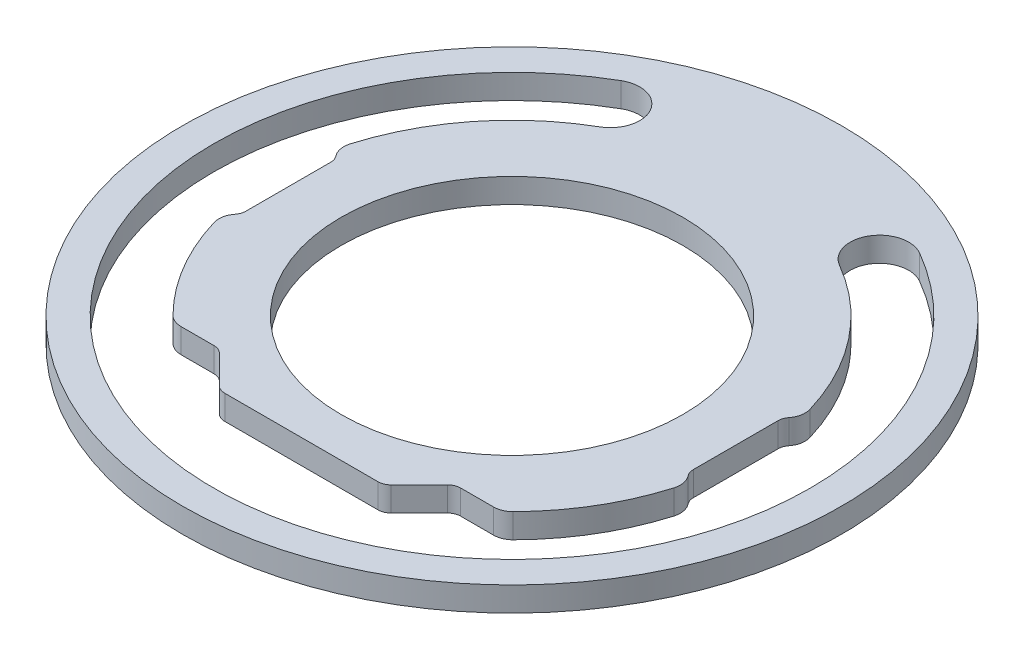
ISO-10303-21;
HEADER;
FILE_DESCRIPTION(('STEP AP214'),'2;1');
FILE_NAME('part.step','',(''),(''),'','','');
FILE_SCHEMA(('AUTOMOTIVE_DESIGN { 1 0 10303 214 1 1 1 1 }'));
ENDSEC;
DATA;
#1=APPLICATION_CONTEXT('core data for automotive mechanical design processes');
#2=APPLICATION_PROTOCOL_DEFINITION('international standard','automotive_design',2000,#1);
#3=PRODUCT_CONTEXT('',#1,'mechanical');
#4=PRODUCT('Part','Part','',(#3));
#5=PRODUCT_RELATED_PRODUCT_CATEGORY('part','',(#4));
#6=PRODUCT_DEFINITION_FORMATION('','',#4);
#7=PRODUCT_DEFINITION_CONTEXT('part definition',#1,'design');
#8=PRODUCT_DEFINITION('design','',#6,#7);
#9=PRODUCT_DEFINITION_SHAPE('','',#8);
#10=(LENGTH_UNIT() NAMED_UNIT(*) SI_UNIT(.MILLI.,.METRE.));
#11=(NAMED_UNIT(*) PLANE_ANGLE_UNIT() SI_UNIT($,.RADIAN.));
#12=(NAMED_UNIT(*) SI_UNIT($,.STERADIAN.) SOLID_ANGLE_UNIT());
#13=UNCERTAINTY_MEASURE_WITH_UNIT(LENGTH_MEASURE(1.E-05),#10,'distance_accuracy_value','');
#14=(GEOMETRIC_REPRESENTATION_CONTEXT(3) GLOBAL_UNCERTAINTY_ASSIGNED_CONTEXT((#13)) GLOBAL_UNIT_ASSIGNED_CONTEXT((#10,
#11,#12)) REPRESENTATION_CONTEXT('',''));
#15=CARTESIAN_POINT('',(0.,0.,0.));
#16=DIRECTION('',(0.,0.,1.));
#17=DIRECTION('',(1.,0.,0.));
#18=AXIS2_PLACEMENT_3D('',#15,#16,#17);
#19=CARTESIAN_POINT('',(0.,3.175,0.));
#20=DIRECTION('',(0.,1.,0.));
#21=DIRECTION('',(0.,0.,1.));
#22=AXIS2_PLACEMENT_3D('',#19,#20,#21);
#23=PLANE('',#22);
#24=DIRECTION('',(1.,0.,0.));
#25=VECTOR('',#24,1.);
#26=CARTESIAN_POINT('',(0.,3.175,22.7217897993642));
#27=LINE('',#26,#25);
#28=CARTESIAN_POINT('',(16.0371198799042,3.175,22.7217897993642));
#29=VERTEX_POINT('',#28);
#30=CARTESIAN_POINT('',(20.3189331103846,3.175,22.7217897993641));
#31=VERTEX_POINT('',#30);
#32=EDGE_CURVE('E299',#29,#31,#27,.T.);
#33=ORIENTED_EDGE('',*,*,#32,.T.);
#34=CARTESIAN_POINT('',(20.3189331103845,3.175,20.1817897993641));
#35=DIRECTION('',(0.,1.,0.));
#36=DIRECTION('',(0.,0.,1.));
#37=AXIS2_PLACEMENT_3D('',#34,#35,#36);
#38=CIRCLE('',#37,2.54);
#39=CARTESIAN_POINT('',(22.1210557809286,3.175,21.9717489833432));
#40=VERTEX_POINT('',#39);
#41=EDGE_CURVE('E471',#31,#40,#38,.T.);
#42=ORIENTED_EDGE('',*,*,#41,.T.);
#43=CARTESIAN_POINT('',(0.,3.175,0.));
#44=DIRECTION('',(0.,-1.,0.));
#45=DIRECTION('',(0.,0.,1.));
#46=AXIS2_PLACEMENT_3D('',#43,#44,#45);
#47=CIRCLE('',#46,31.1785);
#48=CARTESIAN_POINT('',(29.8983970830745,3.175,8.84221205993165));
#49=VERTEX_POINT('',#48);
#50=EDGE_CURVE('E418',#49,#40,#47,.T.);
#51=ORIENTED_EDGE('',*,*,#50,.F.);
#52=CARTESIAN_POINT('',(27.4626824530888,3.175,8.12186891859302));
#53=DIRECTION('',(0.,1.,0.));
#54=DIRECTION('',(0.,0.,1.));
#55=AXIS2_PLACEMENT_3D('',#52,#53,#54);
#56=CIRCLE('',#55,2.54);
#57=CARTESIAN_POINT('',(29.4606461810242,3.175,6.553512791352));
#58=VERTEX_POINT('',#57);
#59=EDGE_CURVE('E462',#49,#58,#56,.T.);
#60=ORIENTED_EDGE('',*,*,#59,.T.);
#61=CARTESIAN_POINT('',(30.7900000000049,3.175,5.51000024999875));
#62=DIRECTION('',(0.,1.,0.));
#63=DIRECTION('',(0.,0.,1.));
#64=AXIS2_PLACEMENT_3D('',#61,#62,#63);
#65=CIRCLE('',#64,1.68999999999995);
#66=CARTESIAN_POINT('',(29.1000000000049,3.175,5.51000024999876));
#67=VERTEX_POINT('',#66);
#68=EDGE_CURVE('E362',#67,#58,#65,.T.);
#69=ORIENTED_EDGE('',*,*,#68,.F.);
#70=DIRECTION('',(0.,0.,-1.));
#71=VECTOR('',#70,1.);
#72=CARTESIAN_POINT('',(29.1000000000049,3.175,-1.09939275921327E-13));
#73=LINE('',#72,#71);
#74=CARTESIAN_POINT('',(29.1000000000049,3.175,-5.51000024999895));
#75=VERTEX_POINT('',#74);
#76=EDGE_CURVE('E374',#67,#75,#73,.T.);
#77=ORIENTED_EDGE('',*,*,#76,.T.);
#78=CARTESIAN_POINT('',(30.7900000000052,3.175,-5.51000024999892));
#79=DIRECTION('',(0.,1.,0.));
#80=DIRECTION('',(0.,0.,1.));
#81=AXIS2_PLACEMENT_3D('',#78,#79,#80);
#82=CIRCLE('',#81,1.69000000000029);
#83=CARTESIAN_POINT('',(29.4606461810242,3.175,-6.55351279135231));
#84=VERTEX_POINT('',#83);
#85=EDGE_CURVE('E371',#84,#75,#82,.T.);
#86=ORIENTED_EDGE('',*,*,#85,.F.);
#87=CARTESIAN_POINT('',(27.4626824530888,3.175,-8.12186891859324));
#88=DIRECTION('',(0.,1.,0.));
#89=DIRECTION('',(0.,0.,1.));
#90=AXIS2_PLACEMENT_3D('',#87,#88,#89);
#91=CIRCLE('',#90,2.54);
#92=CARTESIAN_POINT('',(29.8983970830745,3.175,-8.84221205993189));
#93=VERTEX_POINT('',#92);
#94=EDGE_CURVE('E465',#84,#93,#91,.T.);
#95=ORIENTED_EDGE('',*,*,#94,.T.);
#96=CARTESIAN_POINT('',(15.58925,3.175,-27.0013730518931));
#97=VERTEX_POINT('',#96);
#98=EDGE_CURVE('E414',#97,#93,#47,.T.);
#99=ORIENTED_EDGE('',*,*,#98,.F.);
#100=CARTESIAN_POINT('',(17.49425,3.175,-30.3009298403118));
#101=DIRECTION('',(0.,1.,0.));
#102=DIRECTION('',(0.,0.,1.));
#103=AXIS2_PLACEMENT_3D('',#100,#101,#102);
#104=CIRCLE('',#103,3.81);
#105=CARTESIAN_POINT('',(19.39925,3.175,-33.6004866287305));
#106=VERTEX_POINT('',#105);
#107=EDGE_CURVE('E409',#106,#97,#104,.T.);
#108=ORIENTED_EDGE('',*,*,#107,.F.);
#109=CARTESIAN_POINT('',(0.,3.175,0.));
#110=DIRECTION('',(0.,1.,0.));
#111=DIRECTION('',(0.,0.,1.));
#112=AXIS2_PLACEMENT_3D('',#109,#110,#111);
#113=CIRCLE('',#112,38.7985);
#114=CARTESIAN_POINT('',(-19.39925,3.175,-33.6004866287305));
#115=VERTEX_POINT('',#114);
#116=EDGE_CURVE('E262',#115,#106,#113,.T.);
#117=ORIENTED_EDGE('',*,*,#116,.F.);
#118=CARTESIAN_POINT('',(-17.49425,3.175,-30.3009298403118));
#119=DIRECTION('',(0.,1.,0.));
#120=DIRECTION('',(0.,0.,1.));
#121=AXIS2_PLACEMENT_3D('',#118,#119,#120);
#122=CIRCLE('',#121,3.81);
#123=CARTESIAN_POINT('',(-15.58925,3.175,-27.0013730518931));
#124=VERTEX_POINT('',#123);
#125=EDGE_CURVE('E391',#124,#115,#122,.T.);
#126=ORIENTED_EDGE('',*,*,#125,.F.);
#127=CARTESIAN_POINT('',(-29.8983970830763,3.175,-8.8422120599258));
#128=VERTEX_POINT('',#127);
#129=EDGE_CURVE('E413',#128,#124,#47,.T.);
#130=ORIENTED_EDGE('',*,*,#129,.F.);
#131=CARTESIAN_POINT('',(-27.4626824530904,3.175,-8.12186891858765));
#132=DIRECTION('',(0.,1.,0.));
#133=DIRECTION('',(0.,0.,1.));
#134=AXIS2_PLACEMENT_3D('',#131,#132,#133);
#135=CIRCLE('',#134,2.54);
#136=CARTESIAN_POINT('',(-29.4606461810249,3.175,-6.55351279134543));
#137=VERTEX_POINT('',#136);
#138=EDGE_CURVE('E456',#128,#137,#135,.T.);
#139=ORIENTED_EDGE('',*,*,#138,.T.);
#140=CARTESIAN_POINT('',(-30.7900000000049,3.175,-5.51000024999136));
#141=DIRECTION('',(0.,1.,0.));
#142=DIRECTION('',(0.,0.,1.));
#143=AXIS2_PLACEMENT_3D('',#140,#141,#142);
#144=CIRCLE('',#143,1.69);
#145=CARTESIAN_POINT('',(-29.1000000000049,3.175,-5.51000024999137));
#146=VERTEX_POINT('',#145);
#147=EDGE_CURVE('E242',#146,#137,#144,.T.);
#148=ORIENTED_EDGE('',*,*,#147,.F.);
#149=DIRECTION('',(0.,0.,1.));
#150=VECTOR('',#149,1.);
#151=CARTESIAN_POINT('',(-29.1000000000049,3.175,1.09939275921474E-13));
#152=LINE('',#151,#150);
#153=CARTESIAN_POINT('',(-29.1000000000049,3.175,5.51000024999161));
#154=VERTEX_POINT('',#153);
#155=EDGE_CURVE('E904',#146,#154,#152,.T.);
#156=ORIENTED_EDGE('',*,*,#155,.T.);
#157=CARTESIAN_POINT('',(-30.7900000000049,3.175,5.51000024999102));
#158=DIRECTION('',(0.,1.,0.));
#159=DIRECTION('',(0.,0.,1.));
#160=AXIS2_PLACEMENT_3D('',#157,#158,#159);
#161=CIRCLE('',#160,1.69000000000001);
#162=CARTESIAN_POINT('',(-29.4606461810249,3.175,6.55351279134515));
#163=VERTEX_POINT('',#162);
#164=EDGE_CURVE('E257',#163,#154,#161,.T.);
#165=ORIENTED_EDGE('',*,*,#164,.F.);
#166=CARTESIAN_POINT('',(-27.4626824530905,3.175,8.12186891858744));
#167=DIRECTION('',(0.,1.,0.));
#168=DIRECTION('',(0.,0.,1.));
#169=AXIS2_PLACEMENT_3D('',#166,#167,#168);
#170=CIRCLE('',#169,2.54);
#171=CARTESIAN_POINT('',(-29.8983970830763,3.175,8.84221205992558));
#172=VERTEX_POINT('',#171);
#173=EDGE_CURVE('E459',#163,#172,#170,.T.);
#174=ORIENTED_EDGE('',*,*,#173,.T.);
#175=CARTESIAN_POINT('',(-22.1210557809365,3.175,21.9717489833353));
#176=VERTEX_POINT('',#175);
#177=EDGE_CURVE('E419',#176,#172,#47,.T.);
#178=ORIENTED_EDGE('',*,*,#177,.F.);
#179=CARTESIAN_POINT('',(-20.3189331103918,3.175,20.1817897993569));
#180=DIRECTION('',(0.,1.,0.));
#181=DIRECTION('',(0.,0.,1.));
#182=AXIS2_PLACEMENT_3D('',#179,#180,#181);
#183=CIRCLE('',#182,2.54);
#184=CARTESIAN_POINT('',(-20.3189331103918,3.175,22.7217897993569));
#185=VERTEX_POINT('',#184);
#186=EDGE_CURVE('E468',#176,#185,#183,.T.);
#187=ORIENTED_EDGE('',*,*,#186,.T.);
#188=DIRECTION('',(1.,0.,0.));
#189=VECTOR('',#188,1.);
#190=CARTESIAN_POINT('',(0.,3.175,22.7217897993568));
#191=LINE('',#190,#189);
#192=CARTESIAN_POINT('',(-16.0371198799084,3.175,22.7217897993569));
#193=VERTEX_POINT('',#192);
#194=EDGE_CURVE('E272',#185,#193,#191,.T.);
#195=ORIENTED_EDGE('',*,*,#194,.T.);
#196=CARTESIAN_POINT('',(-16.0371198799109,3.175,24.4117897993573));
#197=DIRECTION('',(0.,1.,0.));
#198=DIRECTION('',(0.,0.,1.));
#199=AXIS2_PLACEMENT_3D('',#196,#197,#198);
#200=CIRCLE('',#199,1.69000000000048);
#201=CARTESIAN_POINT('',(-14.8421094197053,3.175,23.2167793391517));
#202=VERTEX_POINT('',#201);
#203=EDGE_CURVE('E328',#202,#193,#200,.T.);
#204=ORIENTED_EDGE('',*,*,#203,.F.);
#205=DIRECTION('',(0.70710678118655,0.,0.707106781186545));
#206=VECTOR('',#205,1.);
#207=CARTESIAN_POINT('',(-19.0294443794285,3.175,19.0294443794286));
#208=LINE('',#207,#206);
#209=CARTESIAN_POINT('',(-11.1649895397948,3.175,26.8938992190622));
#210=VERTEX_POINT('',#209);
#211=EDGE_CURVE('E324',#202,#210,#208,.T.);
#212=ORIENTED_EDGE('',*,*,#211,.T.);
#213=CARTESIAN_POINT('',(-9.96997907958564,3.175,25.6988887588604));
#214=DIRECTION('',(0.,1.,0.));
#215=DIRECTION('',(0.,0.,1.));
#216=AXIS2_PLACEMENT_3D('',#213,#214,#215);
#217=CIRCLE('',#216,1.69000000000029);
#218=CARTESIAN_POINT('',(-9.96997907958563,3.175,27.3888887588607));
#219=VERTEX_POINT('',#218);
#220=EDGE_CURVE('E320',#210,#219,#217,.T.);
#221=ORIENTED_EDGE('',*,*,#220,.T.);
#222=DIRECTION('',(1.,0.,0.));
#223=VECTOR('',#222,1.);
#224=CARTESIAN_POINT('',(0.,3.175,27.3888887588607));
#225=LINE('',#224,#223);
#226=CARTESIAN_POINT('',(9.96997907958636,3.175,27.3888887588607));
#227=VERTEX_POINT('',#226);
#228=EDGE_CURVE('E316',#219,#227,#225,.T.);
#229=ORIENTED_EDGE('',*,*,#228,.T.);
#230=CARTESIAN_POINT('',(9.9699790795865,3.175,25.6988887588606));
#231=DIRECTION('',(0.,1.,0.));
#232=DIRECTION('',(0.,0.,1.));
#233=AXIS2_PLACEMENT_3D('',#230,#231,#232);
#234=CIRCLE('',#233,1.69000000000001);
#235=CARTESIAN_POINT('',(11.1649895397918,3.175,26.8938992190659));
#236=VERTEX_POINT('',#235);
#237=EDGE_CURVE('E312',#227,#236,#234,.T.);
#238=ORIENTED_EDGE('',*,*,#237,.T.);
#239=DIRECTION('',(0.707106781186545,0.,-0.70710678118655));
#240=VECTOR('',#239,1.);
#241=CARTESIAN_POINT('',(19.0294443794289,3.175,19.0294443794288));
#242=LINE('',#241,#240);
#243=CARTESIAN_POINT('',(14.8421094197003,3.175,23.2167793391573));
#244=VERTEX_POINT('',#243);
#245=EDGE_CURVE('E308',#236,#244,#242,.T.);
#246=ORIENTED_EDGE('',*,*,#245,.T.);
#247=CARTESIAN_POINT('',(16.0371198799042,3.175,24.4117897993646));
#248=DIRECTION('',(0.,1.,0.));
#249=DIRECTION('',(0.,0.,1.));
#250=AXIS2_PLACEMENT_3D('',#247,#248,#249);
#251=CIRCLE('',#250,1.69000000000045);
#252=EDGE_CURVE('E303',#29,#244,#251,.T.);
#253=ORIENTED_EDGE('',*,*,#252,.F.);
#254=EDGE_LOOP('',(#33,#42,#51,#60,#69,#77,#86,#95,#99,#108,#117,#126,#130,#139,#148,#156,#165,
#174,#178,#187,#195,#204,#212,#221,#229,#238,#246,#253));
#255=FACE_BOUND('',#254,.T.);
#256=CARTESIAN_POINT('',(0.,3.175,0.));
#257=DIRECTION('',(0.,1.,0.));
#258=DIRECTION('',(0.,0.,1.));
#259=AXIS2_PLACEMENT_3D('',#256,#257,#258);
#260=CIRCLE('',#259,42.8625);
#261=CARTESIAN_POINT('',(0.,3.175,42.8625));
#262=VERTEX_POINT('',#261);
#263=EDGE_CURVE('E445',#262,#262,#260,.T.);
#264=ORIENTED_EDGE('',*,*,#263,.T.);
#265=EDGE_LOOP('',(#264));
#266=FACE_BOUND('',#265,.T.);
#267=CARTESIAN_POINT('',(0.,3.175,0.));
#268=DIRECTION('',(0.,1.,0.));
#269=DIRECTION('',(0.,0.,1.));
#270=AXIS2_PLACEMENT_3D('',#267,#268,#269);
#271=CIRCLE('',#270,22.225);
#272=CARTESIAN_POINT('',(0.,3.175,22.225));
#273=VERTEX_POINT('',#272);
#274=EDGE_CURVE('E437',#273,#273,#271,.T.);
#275=ORIENTED_EDGE('',*,*,#274,.F.);
#276=EDGE_LOOP('',(#275));
#277=FACE_BOUND('',#276,.T.);
#278=ADVANCED_FACE('F46',(#255,#266,#277),#23,.T.);
#279=CARTESIAN_POINT('',(0.,0.,0.));
#280=DIRECTION('',(0.,1.,0.));
#281=DIRECTION('',(0.,0.,1.));
#282=AXIS2_PLACEMENT_3D('',#279,#280,#281);
#283=PLANE('',#282);
#284=CARTESIAN_POINT('',(0.,0.,0.));
#285=DIRECTION('',(0.,1.,0.));
#286=DIRECTION('',(0.,0.,1.));
#287=AXIS2_PLACEMENT_3D('',#284,#285,#286);
#288=CIRCLE('',#287,22.225);
#289=CARTESIAN_POINT('',(0.,0.,22.225));
#290=VERTEX_POINT('',#289);
#291=EDGE_CURVE('E426',#290,#290,#288,.T.);
#292=ORIENTED_EDGE('',*,*,#291,.T.);
#293=EDGE_LOOP('',(#292));
#294=FACE_BOUND('',#293,.T.);
#295=CARTESIAN_POINT('',(0.,0.,0.));
#296=DIRECTION('',(0.,1.,0.));
#297=DIRECTION('',(0.,0.,1.));
#298=AXIS2_PLACEMENT_3D('',#295,#296,#297);
#299=CIRCLE('',#298,42.8625);
#300=CARTESIAN_POINT('',(0.,0.,42.8625));
#301=VERTEX_POINT('',#300);
#302=EDGE_CURVE('E441',#301,#301,#299,.T.);
#303=ORIENTED_EDGE('',*,*,#302,.F.);
#304=EDGE_LOOP('',(#303));
#305=FACE_BOUND('',#304,.T.);
#306=CARTESIAN_POINT('',(0.,0.,0.));
#307=DIRECTION('',(0.,-1.,0.));
#308=DIRECTION('',(0.,0.,1.));
#309=AXIS2_PLACEMENT_3D('',#306,#307,#308);
#310=CIRCLE('',#309,31.1785);
#311=CARTESIAN_POINT('',(29.8983970830745,0.,8.84221205993165));
#312=VERTEX_POINT('',#311);
#313=CARTESIAN_POINT('',(22.1210557809286,0.,21.9717489833432));
#314=VERTEX_POINT('',#313);
#315=EDGE_CURVE('E401',#312,#314,#310,.T.);
#316=ORIENTED_EDGE('',*,*,#315,.T.);
#317=CARTESIAN_POINT('',(20.3189331103845,0.,20.1817897993641));
#318=DIRECTION('',(0.,1.,0.));
#319=DIRECTION('',(0.,0.,1.));
#320=AXIS2_PLACEMENT_3D('',#317,#318,#319);
#321=CIRCLE('',#320,2.54);
#322=CARTESIAN_POINT('',(20.3189331103846,0.,22.7217897993641));
#323=VERTEX_POINT('',#322);
#324=EDGE_CURVE('E495',#314,#323,#321,.F.);
#325=ORIENTED_EDGE('',*,*,#324,.T.);
#326=DIRECTION('',(1.,0.,0.));
#327=VECTOR('',#326,1.);
#328=CARTESIAN_POINT('',(0.,0.,22.7217897993642));
#329=LINE('',#328,#327);
#330=CARTESIAN_POINT('',(16.0371198799042,0.,22.7217897993642));
#331=VERTEX_POINT('',#330);
#332=EDGE_CURVE('E267',#331,#323,#329,.T.);
#333=ORIENTED_EDGE('',*,*,#332,.F.);
#334=CARTESIAN_POINT('',(16.0371198799042,0.,24.4117897993646));
#335=DIRECTION('',(0.,1.,0.));
#336=DIRECTION('',(0.,0.,1.));
#337=AXIS2_PLACEMENT_3D('',#334,#335,#336);
#338=CIRCLE('',#337,1.69000000000045);
#339=CARTESIAN_POINT('',(14.8421094197003,0.,23.2167793391573));
#340=VERTEX_POINT('',#339);
#341=EDGE_CURVE('E271',#331,#340,#338,.T.);
#342=ORIENTED_EDGE('',*,*,#341,.T.);
#343=DIRECTION('',(0.707106781186545,0.,-0.70710678118655));
#344=VECTOR('',#343,1.);
#345=CARTESIAN_POINT('',(19.0294443794289,0.,19.0294443794288));
#346=LINE('',#345,#344);
#347=CARTESIAN_POINT('',(11.1649895397918,0.,26.8938992190659));
#348=VERTEX_POINT('',#347);
#349=EDGE_CURVE('E276',#348,#340,#346,.T.);
#350=ORIENTED_EDGE('',*,*,#349,.F.);
#351=CARTESIAN_POINT('',(9.9699790795865,0.,25.6988887588606));
#352=DIRECTION('',(0.,1.,0.));
#353=DIRECTION('',(0.,0.,1.));
#354=AXIS2_PLACEMENT_3D('',#351,#352,#353);
#355=CIRCLE('',#354,1.69000000000001);
#356=CARTESIAN_POINT('',(9.96997907958636,0.,27.3888887588607));
#357=VERTEX_POINT('',#356);
#358=EDGE_CURVE('E279',#357,#348,#355,.T.);
#359=ORIENTED_EDGE('',*,*,#358,.F.);
#360=DIRECTION('',(1.,0.,0.));
#361=VECTOR('',#360,1.);
#362=CARTESIAN_POINT('',(0.,0.,27.3888887588607));
#363=LINE('',#362,#361);
#364=CARTESIAN_POINT('',(-9.96997907958563,0.,27.3888887588607));
#365=VERTEX_POINT('',#364);
#366=EDGE_CURVE('E282',#365,#357,#363,.T.);
#367=ORIENTED_EDGE('',*,*,#366,.F.);
#368=CARTESIAN_POINT('',(-9.96997907958564,0.,25.6988887588604));
#369=DIRECTION('',(0.,1.,0.));
#370=DIRECTION('',(0.,0.,1.));
#371=AXIS2_PLACEMENT_3D('',#368,#369,#370);
#372=CIRCLE('',#371,1.69000000000029);
#373=CARTESIAN_POINT('',(-11.1649895397948,0.,26.8938992190622));
#374=VERTEX_POINT('',#373);
#375=EDGE_CURVE('E285',#374,#365,#372,.T.);
#376=ORIENTED_EDGE('',*,*,#375,.F.);
#377=DIRECTION('',(0.70710678118655,0.,0.707106781186545));
#378=VECTOR('',#377,1.);
#379=CARTESIAN_POINT('',(-19.0294443794285,0.,19.0294443794286));
#380=LINE('',#379,#378);
#381=CARTESIAN_POINT('',(-14.8421094197053,0.,23.2167793391517));
#382=VERTEX_POINT('',#381);
#383=EDGE_CURVE('E288',#382,#374,#380,.T.);
#384=ORIENTED_EDGE('',*,*,#383,.F.);
#385=CARTESIAN_POINT('',(-16.0371198799109,0.,24.4117897993573));
#386=DIRECTION('',(0.,1.,0.));
#387=DIRECTION('',(0.,0.,1.));
#388=AXIS2_PLACEMENT_3D('',#385,#386,#387);
#389=CIRCLE('',#388,1.69000000000048);
#390=CARTESIAN_POINT('',(-16.0371198799084,0.,22.7217897993569));
#391=VERTEX_POINT('',#390);
#392=EDGE_CURVE('E291',#382,#391,#389,.T.);
#393=ORIENTED_EDGE('',*,*,#392,.T.);
#394=DIRECTION('',(1.,0.,0.));
#395=VECTOR('',#394,1.);
#396=CARTESIAN_POINT('',(0.,0.,22.7217897993568));
#397=LINE('',#396,#395);
#398=CARTESIAN_POINT('',(-20.3189331103918,0.,22.7217897993569));
#399=VERTEX_POINT('',#398);
#400=EDGE_CURVE('E295',#399,#391,#397,.T.);
#401=ORIENTED_EDGE('',*,*,#400,.F.);
#402=CARTESIAN_POINT('',(-20.3189331103918,0.,20.1817897993569));
#403=DIRECTION('',(0.,1.,0.));
#404=DIRECTION('',(0.,0.,1.));
#405=AXIS2_PLACEMENT_3D('',#402,#403,#404);
#406=CIRCLE('',#405,2.54);
#407=CARTESIAN_POINT('',(-22.1210557809365,0.,21.9717489833353));
#408=VERTEX_POINT('',#407);
#409=EDGE_CURVE('E492',#399,#408,#406,.F.);
#410=ORIENTED_EDGE('',*,*,#409,.T.);
#411=CARTESIAN_POINT('',(-29.8983970830763,0.,8.84221205992558));
#412=VERTEX_POINT('',#411);
#413=EDGE_CURVE('E402',#408,#412,#310,.T.);
#414=ORIENTED_EDGE('',*,*,#413,.T.);
#415=CARTESIAN_POINT('',(-27.4626824530905,0.,8.12186891858744));
#416=DIRECTION('',(0.,1.,0.));
#417=DIRECTION('',(0.,0.,1.));
#418=AXIS2_PLACEMENT_3D('',#415,#416,#417);
#419=CIRCLE('',#418,2.54);
#420=CARTESIAN_POINT('',(-29.4606461810249,0.,6.55351279134515));
#421=VERTEX_POINT('',#420);
#422=EDGE_CURVE('E62',#412,#421,#419,.F.);
#423=ORIENTED_EDGE('',*,*,#422,.T.);
#424=CARTESIAN_POINT('',(-30.7900000000049,0.,5.51000024999102));
#425=DIRECTION('',(0.,1.,0.));
#426=DIRECTION('',(0.,0.,1.));
#427=AXIS2_PLACEMENT_3D('',#424,#425,#426);
#428=CIRCLE('',#427,1.69000000000001);
#429=CARTESIAN_POINT('',(-29.1000000000049,0.,5.51000024999161));
#430=VERTEX_POINT('',#429);
#431=EDGE_CURVE('E231',#421,#430,#428,.T.);
#432=ORIENTED_EDGE('',*,*,#431,.T.);
#433=DIRECTION('',(0.,0.,1.));
#434=VECTOR('',#433,1.);
#435=CARTESIAN_POINT('',(-29.1000000000049,0.,1.09939275921474E-13));
#436=LINE('',#435,#434);
#437=CARTESIAN_POINT('',(-29.1000000000049,0.,-5.51000024999137));
#438=VERTEX_POINT('',#437);
#439=EDGE_CURVE('E236',#438,#430,#436,.T.);
#440=ORIENTED_EDGE('',*,*,#439,.F.);
#441=CARTESIAN_POINT('',(-30.7900000000049,0.,-5.51000024999136));
#442=DIRECTION('',(0.,1.,0.));
#443=DIRECTION('',(0.,0.,1.));
#444=AXIS2_PLACEMENT_3D('',#441,#442,#443);
#445=CIRCLE('',#444,1.69);
#446=CARTESIAN_POINT('',(-29.4606461810249,0.,-6.55351279134543));
#447=VERTEX_POINT('',#446);
#448=EDGE_CURVE('E253',#438,#447,#445,.T.);
#449=ORIENTED_EDGE('',*,*,#448,.T.);
#450=CARTESIAN_POINT('',(-27.4626824530904,0.,-8.12186891858765));
#451=DIRECTION('',(0.,1.,0.));
#452=DIRECTION('',(0.,0.,1.));
#453=AXIS2_PLACEMENT_3D('',#450,#451,#452);
#454=CIRCLE('',#453,2.54);
#455=CARTESIAN_POINT('',(-29.8983970830763,0.,-8.8422120599258));
#456=VERTEX_POINT('',#455);
#457=EDGE_CURVE('E481',#447,#456,#454,.F.);
#458=ORIENTED_EDGE('',*,*,#457,.T.);
#459=CARTESIAN_POINT('',(-15.58925,0.,-27.0013730518931));
#460=VERTEX_POINT('',#459);
#461=EDGE_CURVE('E395',#456,#460,#310,.T.);
#462=ORIENTED_EDGE('',*,*,#461,.T.);
#463=CARTESIAN_POINT('',(-17.49425,0.,-30.3009298403118));
#464=DIRECTION('',(0.,1.,0.));
#465=DIRECTION('',(0.,0.,1.));
#466=AXIS2_PLACEMENT_3D('',#463,#464,#465);
#467=CIRCLE('',#466,3.81);
#468=CARTESIAN_POINT('',(-19.39925,0.,-33.6004866287305));
#469=VERTEX_POINT('',#468);
#470=EDGE_CURVE('E400',#460,#469,#467,.T.);
#471=ORIENTED_EDGE('',*,*,#470,.T.);
#472=CARTESIAN_POINT('',(0.,0.,0.));
#473=DIRECTION('',(0.,1.,0.));
#474=DIRECTION('',(0.,0.,1.));
#475=AXIS2_PLACEMENT_3D('',#472,#473,#474);
#476=CIRCLE('',#475,38.7985);
#477=CARTESIAN_POINT('',(19.39925,0.,-33.6004866287305));
#478=VERTEX_POINT('',#477);
#479=EDGE_CURVE('E386',#469,#478,#476,.T.);
#480=ORIENTED_EDGE('',*,*,#479,.T.);
#481=CARTESIAN_POINT('',(17.49425,0.,-30.3009298403118));
#482=DIRECTION('',(0.,1.,0.));
#483=DIRECTION('',(0.,0.,1.));
#484=AXIS2_PLACEMENT_3D('',#481,#482,#483);
#485=CIRCLE('',#484,3.81);
#486=CARTESIAN_POINT('',(15.58925,0.,-27.0013730518931));
#487=VERTEX_POINT('',#486);
#488=EDGE_CURVE('E390',#478,#487,#485,.T.);
#489=ORIENTED_EDGE('',*,*,#488,.T.);
#490=CARTESIAN_POINT('',(29.8983970830745,0.,-8.84221205993189));
#491=VERTEX_POINT('',#490);
#492=EDGE_CURVE('E396',#487,#491,#310,.T.);
#493=ORIENTED_EDGE('',*,*,#492,.T.);
#494=CARTESIAN_POINT('',(27.4626824530888,0.,-8.12186891859324));
#495=DIRECTION('',(0.,1.,0.));
#496=DIRECTION('',(0.,0.,1.));
#497=AXIS2_PLACEMENT_3D('',#494,#495,#496);
#498=CIRCLE('',#497,2.54);
#499=CARTESIAN_POINT('',(29.4606461810242,0.,-6.55351279135231));
#500=VERTEX_POINT('',#499);
#501=EDGE_CURVE('E489',#491,#500,#498,.F.);
#502=ORIENTED_EDGE('',*,*,#501,.T.);
#503=CARTESIAN_POINT('',(30.7900000000052,0.,-5.51000024999892));
#504=DIRECTION('',(0.,1.,0.));
#505=DIRECTION('',(0.,0.,1.));
#506=AXIS2_PLACEMENT_3D('',#503,#504,#505);
#507=CIRCLE('',#506,1.69000000000029);
#508=CARTESIAN_POINT('',(29.1000000000049,0.,-5.51000024999895));
#509=VERTEX_POINT('',#508);
#510=EDGE_CURVE('E358',#500,#509,#507,.T.);
#511=ORIENTED_EDGE('',*,*,#510,.T.);
#512=DIRECTION('',(0.,0.,-1.));
#513=VECTOR('',#512,1.);
#514=CARTESIAN_POINT('',(29.1000000000049,0.,-1.09939275921327E-13));
#515=LINE('',#514,#513);
#516=CARTESIAN_POINT('',(29.1000000000049,0.,5.51000024999876));
#517=VERTEX_POINT('',#516);
#518=EDGE_CURVE('E361',#517,#509,#515,.T.);
#519=ORIENTED_EDGE('',*,*,#518,.F.);
#520=CARTESIAN_POINT('',(30.7900000000049,0.,5.51000024999875));
#521=DIRECTION('',(0.,1.,0.));
#522=DIRECTION('',(0.,0.,1.));
#523=AXIS2_PLACEMENT_3D('',#520,#521,#522);
#524=CIRCLE('',#523,1.68999999999995);
#525=CARTESIAN_POINT('',(29.4606461810242,0.,6.553512791352));
#526=VERTEX_POINT('',#525);
#527=EDGE_CURVE('E366',#517,#526,#524,.T.);
#528=ORIENTED_EDGE('',*,*,#527,.T.);
#529=CARTESIAN_POINT('',(27.4626824530888,0.,8.12186891859302));
#530=DIRECTION('',(0.,1.,0.));
#531=DIRECTION('',(0.,0.,1.));
#532=AXIS2_PLACEMENT_3D('',#529,#530,#531);
#533=CIRCLE('',#532,2.54);
#534=EDGE_CURVE('E486',#526,#312,#533,.F.);
#535=ORIENTED_EDGE('',*,*,#534,.T.);
#536=EDGE_LOOP('',(#316,#325,#333,#342,#350,#359,#367,#376,#384,#393,#401,#410,#414,#423,#432,
#440,#449,#458,#462,#471,#480,#489,#493,#502,#511,#519,#528,#535));
#537=FACE_BOUND('',#536,.T.);
#538=ADVANCED_FACE('F234',(#294,#305,#537),#283,.F.);
#539=CARTESIAN_POINT('',(0.,0.,0.));
#540=DIRECTION('',(0.,1.,0.));
#541=DIRECTION('',(0.,0.,1.));
#542=AXIS2_PLACEMENT_3D('',#539,#540,#541);
#543=CYLINDRICAL_SURFACE('',#542,31.1785);
#544=ORIENTED_EDGE('',*,*,#461,.F.);
#545=DIRECTION('',(0.,1.,0.));
#546=VECTOR('',#545,1.);
#547=CARTESIAN_POINT('',(-29.8983970830763,0.,-8.8422120599258));
#548=LINE('',#547,#546);
#549=EDGE_CURVE('E55',#456,#128,#548,.T.);
#550=ORIENTED_EDGE('',*,*,#549,.T.);
#551=ORIENTED_EDGE('',*,*,#129,.T.);
#552=DIRECTION('',(0.,1.,0.));
#553=VECTOR('',#552,1.);
#554=CARTESIAN_POINT('',(-15.58925,0.,-27.0013730518931));
#555=LINE('',#554,#553);
#556=EDGE_CURVE('E427',#460,#124,#555,.T.);
#557=ORIENTED_EDGE('',*,*,#556,.F.);
#558=EDGE_LOOP('',(#544,#550,#551,#557));
#559=FACE_BOUND('',#558,.T.);
#560=ADVANCED_FACE('F525',(#559),#543,.T.);
#561=ORIENTED_EDGE('',*,*,#50,.T.);
#562=DIRECTION('',(0.,1.,0.));
#563=VECTOR('',#562,1.);
#564=CARTESIAN_POINT('',(22.1210557809286,0.,21.9717489833432));
#565=LINE('',#564,#563);
#566=EDGE_CURVE('E478',#40,#314,#565,.F.);
#567=ORIENTED_EDGE('',*,*,#566,.T.);
#568=ORIENTED_EDGE('',*,*,#315,.F.);
#569=DIRECTION('',(0.,1.,0.));
#570=VECTOR('',#569,1.);
#571=CARTESIAN_POINT('',(29.8983970830745,0.,8.84221205993165));
#572=LINE('',#571,#570);
#573=EDGE_CURVE('E474',#312,#49,#572,.T.);
#574=ORIENTED_EDGE('',*,*,#573,.T.);
#575=EDGE_LOOP('',(#561,#567,#568,#574));
#576=FACE_BOUND('',#575,.T.);
#577=ADVANCED_FACE('F542',(#576),#543,.T.);
#578=ORIENTED_EDGE('',*,*,#413,.F.);
#579=DIRECTION('',(0.,1.,0.));
#580=VECTOR('',#579,1.);
#581=CARTESIAN_POINT('',(-22.1210557809365,0.,21.9717489833353));
#582=LINE('',#581,#580);
#583=EDGE_CURVE('E500',#408,#176,#582,.T.);
#584=ORIENTED_EDGE('',*,*,#583,.T.);
#585=ORIENTED_EDGE('',*,*,#177,.T.);
#586=DIRECTION('',(0.,1.,0.));
#587=VECTOR('',#586,1.);
#588=CARTESIAN_POINT('',(-29.8983970830763,0.,8.84221205992558));
#589=LINE('',#588,#587);
#590=EDGE_CURVE('E70',#172,#412,#589,.F.);
#591=ORIENTED_EDGE('',*,*,#590,.T.);
#592=EDGE_LOOP('',(#578,#584,#585,#591));
#593=FACE_BOUND('',#592,.T.);
#594=ADVANCED_FACE('F595',(#593),#543,.T.);
#595=CARTESIAN_POINT('',(0.,3.175,0.));
#596=DIRECTION('',(0.,-1.,0.));
#597=DIRECTION('',(0.,0.,-1.));
#598=AXIS2_PLACEMENT_3D('',#595,#596,#597);
#599=CYLINDRICAL_SURFACE('',#598,42.8625);
#600=ORIENTED_EDGE('',*,*,#263,.F.);
#601=EDGE_LOOP('',(#600));
#602=FACE_BOUND('',#601,.T.);
#603=ORIENTED_EDGE('',*,*,#302,.T.);
#604=EDGE_LOOP('',(#603));
#605=FACE_BOUND('',#604,.T.);
#606=ADVANCED_FACE('F620',(#602,#605),#599,.T.);
#607=CARTESIAN_POINT('',(0.,3.175,0.));
#608=DIRECTION('',(0.,-1.,0.));
#609=DIRECTION('',(0.,0.,-1.));
#610=AXIS2_PLACEMENT_3D('',#607,#608,#609);
#611=CYLINDRICAL_SURFACE('',#610,22.225);
#612=ORIENTED_EDGE('',*,*,#274,.T.);
#613=EDGE_LOOP('',(#612));
#614=FACE_BOUND('',#613,.T.);
#615=ORIENTED_EDGE('',*,*,#291,.F.);
#616=EDGE_LOOP('',(#615));
#617=FACE_BOUND('',#616,.T.);
#618=ADVANCED_FACE('F617',(#614,#617),#611,.F.);
#619=CARTESIAN_POINT('',(0.,0.,0.));
#620=DIRECTION('',(0.,1.,0.));
#621=DIRECTION('',(0.,0.,1.));
#622=AXIS2_PLACEMENT_3D('',#619,#620,#621);
#623=CYLINDRICAL_SURFACE('',#622,38.7985);
#624=ORIENTED_EDGE('',*,*,#116,.T.);
#625=DIRECTION('',(0.,1.,0.));
#626=VECTOR('',#625,1.);
#627=CARTESIAN_POINT('',(19.39925,0.,-33.6004866287305));
#628=LINE('',#627,#626);
#629=EDGE_CURVE('E406',#478,#106,#628,.T.);
#630=ORIENTED_EDGE('',*,*,#629,.F.);
#631=ORIENTED_EDGE('',*,*,#479,.F.);
#632=DIRECTION('',(0.,1.,0.));
#633=VECTOR('',#632,1.);
#634=CARTESIAN_POINT('',(-19.39925,0.,-33.6004866287305));
#635=LINE('',#634,#633);
#636=EDGE_CURVE('E423',#469,#115,#635,.T.);
#637=ORIENTED_EDGE('',*,*,#636,.T.);
#638=EDGE_LOOP('',(#624,#630,#631,#637));
#639=FACE_BOUND('',#638,.T.);
#640=ADVANCED_FACE('F658',(#639),#623,.F.);
#641=CARTESIAN_POINT('',(-17.49425,0.,-30.3009298403118));
#642=DIRECTION('',(0.,1.,0.));
#643=DIRECTION('',(0.,0.,1.));
#644=AXIS2_PLACEMENT_3D('',#641,#642,#643);
#645=CYLINDRICAL_SURFACE('',#644,3.81);
#646=ORIENTED_EDGE('',*,*,#125,.T.);
#647=ORIENTED_EDGE('',*,*,#636,.F.);
#648=ORIENTED_EDGE('',*,*,#470,.F.);
#649=ORIENTED_EDGE('',*,*,#556,.T.);
#650=EDGE_LOOP('',(#646,#647,#648,#649));
#651=FACE_BOUND('',#650,.T.);
#652=ADVANCED_FACE('F655',(#651),#645,.F.);
#653=ORIENTED_EDGE('',*,*,#98,.T.);
#654=DIRECTION('',(0.,1.,0.));
#655=VECTOR('',#654,1.);
#656=CARTESIAN_POINT('',(29.8983970830745,0.,-8.84221205993189));
#657=LINE('',#656,#655);
#658=EDGE_CURVE('E511',#93,#491,#657,.F.);
#659=ORIENTED_EDGE('',*,*,#658,.T.);
#660=ORIENTED_EDGE('',*,*,#492,.F.);
#661=DIRECTION('',(0.,1.,0.));
#662=VECTOR('',#661,1.);
#663=CARTESIAN_POINT('',(15.58925,0.,-27.0013730518931));
#664=LINE('',#663,#662);
#665=EDGE_CURVE('E431',#487,#97,#664,.T.);
#666=ORIENTED_EDGE('',*,*,#665,.T.);
#667=EDGE_LOOP('',(#653,#659,#660,#666));
#668=FACE_BOUND('',#667,.T.);
#669=ADVANCED_FACE('F666',(#668),#543,.T.);
#670=CARTESIAN_POINT('',(17.49425,0.,-30.3009298403118));
#671=DIRECTION('',(0.,1.,0.));
#672=DIRECTION('',(0.,0.,1.));
#673=AXIS2_PLACEMENT_3D('',#670,#671,#672);
#674=CYLINDRICAL_SURFACE('',#673,3.81);
#675=ORIENTED_EDGE('',*,*,#107,.T.);
#676=ORIENTED_EDGE('',*,*,#665,.F.);
#677=ORIENTED_EDGE('',*,*,#488,.F.);
#678=ORIENTED_EDGE('',*,*,#629,.T.);
#679=EDGE_LOOP('',(#675,#676,#677,#678));
#680=FACE_BOUND('',#679,.T.);
#681=ADVANCED_FACE('F662',(#680),#674,.F.);
#682=CARTESIAN_POINT('',(30.7900000000049,0.,5.51000024999875));
#683=DIRECTION('',(0.,1.,0.));
#684=DIRECTION('',(0.,0.,1.));
#685=AXIS2_PLACEMENT_3D('',#682,#683,#684);
#686=CYLINDRICAL_SURFACE('',#685,1.68999999999995);
#687=ORIENTED_EDGE('',*,*,#68,.T.);
#688=DIRECTION('',(0.,1.,0.));
#689=VECTOR('',#688,1.);
#690=CARTESIAN_POINT('',(29.4606461810242,0.,6.553512791352));
#691=LINE('',#690,#689);
#692=EDGE_CURVE('E514',#58,#526,#691,.F.);
#693=ORIENTED_EDGE('',*,*,#692,.T.);
#694=ORIENTED_EDGE('',*,*,#527,.F.);
#695=DIRECTION('',(0.,1.,0.));
#696=VECTOR('',#695,1.);
#697=CARTESIAN_POINT('',(29.1000000000049,0.,5.51000024999876));
#698=LINE('',#697,#696);
#699=EDGE_CURVE('E304',#517,#67,#698,.T.);
#700=ORIENTED_EDGE('',*,*,#699,.T.);
#701=EDGE_LOOP('',(#687,#693,#694,#700));
#702=FACE_BOUND('',#701,.T.);
#703=ADVANCED_FACE('F647',(#702),#686,.F.);
#704=CARTESIAN_POINT('',(29.1000000000049,0.,-1.09939275921327E-13));
#705=DIRECTION('',(1.,0.,0.));
#706=DIRECTION('',(0.,0.,-1.));
#707=AXIS2_PLACEMENT_3D('',#704,#705,#706);
#708=PLANE('',#707);
#709=ORIENTED_EDGE('',*,*,#76,.F.);
#710=ORIENTED_EDGE('',*,*,#699,.F.);
#711=ORIENTED_EDGE('',*,*,#518,.T.);
#712=DIRECTION('',(0.,1.,0.));
#713=VECTOR('',#712,1.);
#714=CARTESIAN_POINT('',(29.1000000000049,0.,-5.51000024999895));
#715=LINE('',#714,#713);
#716=EDGE_CURVE('E370',#509,#75,#715,.T.);
#717=ORIENTED_EDGE('',*,*,#716,.T.);
#718=EDGE_LOOP('',(#709,#710,#711,#717));
#719=FACE_BOUND('',#718,.T.);
#720=ADVANCED_FACE('F643',(#719),#708,.T.);
#721=CARTESIAN_POINT('',(30.7900000000052,0.,-5.51000024999892));
#722=DIRECTION('',(0.,1.,0.));
#723=DIRECTION('',(0.,0.,1.));
#724=AXIS2_PLACEMENT_3D('',#721,#722,#723);
#725=CYLINDRICAL_SURFACE('',#724,1.69000000000029);
#726=ORIENTED_EDGE('',*,*,#510,.F.);
#727=DIRECTION('',(0.,1.,0.));
#728=VECTOR('',#727,1.);
#729=CARTESIAN_POINT('',(29.4606461810242,0.,-6.55351279135231));
#730=LINE('',#729,#728);
#731=EDGE_CURVE('E507',#500,#84,#730,.T.);
#732=ORIENTED_EDGE('',*,*,#731,.T.);
#733=ORIENTED_EDGE('',*,*,#85,.T.);
#734=ORIENTED_EDGE('',*,*,#716,.F.);
#735=EDGE_LOOP('',(#726,#732,#733,#734));
#736=FACE_BOUND('',#735,.T.);
#737=ADVANCED_FACE('F639',(#736),#725,.F.);
#738=CARTESIAN_POINT('',(0.,0.,22.7217897993642));
#739=DIRECTION('',(0.,0.,1.));
#740=DIRECTION('',(1.,0.,0.));
#741=AXIS2_PLACEMENT_3D('',#738,#739,#740);
#742=PLANE('',#741);
#743=ORIENTED_EDGE('',*,*,#332,.T.);
#744=DIRECTION('',(0.,-1.,0.));
#745=VECTOR('',#744,1.);
#746=CARTESIAN_POINT('',(20.3189331103846,3.175,22.7217897993641));
#747=LINE('',#746,#745);
#748=EDGE_CURVE('E449',#323,#31,#747,.F.);
#749=ORIENTED_EDGE('',*,*,#748,.T.);
#750=ORIENTED_EDGE('',*,*,#32,.F.);
#751=DIRECTION('',(0.,1.,0.));
#752=VECTOR('',#751,1.);
#753=CARTESIAN_POINT('',(16.0371198799042,0.,22.7217897993642));
#754=LINE('',#753,#752);
#755=EDGE_CURVE('E298',#331,#29,#754,.T.);
#756=ORIENTED_EDGE('',*,*,#755,.F.);
#757=EDGE_LOOP('',(#743,#749,#750,#756));
#758=FACE_BOUND('',#757,.T.);
#759=ADVANCED_FACE('F551',(#758),#742,.T.);
#760=CARTESIAN_POINT('',(0.,0.,22.7217897993568));
#761=DIRECTION('',(0.,0.,1.));
#762=DIRECTION('',(1.,0.,0.));
#763=AXIS2_PLACEMENT_3D('',#760,#761,#762);
#764=PLANE('',#763);
#765=ORIENTED_EDGE('',*,*,#194,.F.);
#766=DIRECTION('',(0.,-1.,0.));
#767=VECTOR('',#766,1.);
#768=CARTESIAN_POINT('',(-20.3189331103918,0.,22.7217897993569));
#769=LINE('',#768,#767);
#770=EDGE_CURVE('E504',#185,#399,#769,.T.);
#771=ORIENTED_EDGE('',*,*,#770,.T.);
#772=ORIENTED_EDGE('',*,*,#400,.T.);
#773=DIRECTION('',(0.,1.,0.));
#774=VECTOR('',#773,1.);
#775=CARTESIAN_POINT('',(-16.0371198799084,0.,22.7217897993569));
#776=LINE('',#775,#774);
#777=EDGE_CURVE('E334',#391,#193,#776,.T.);
#778=ORIENTED_EDGE('',*,*,#777,.T.);
#779=EDGE_LOOP('',(#765,#771,#772,#778));
#780=FACE_BOUND('',#779,.T.);
#781=ADVANCED_FACE('F725',(#780),#764,.T.);
#782=CARTESIAN_POINT('',(-16.0371198799109,0.,24.4117897993573));
#783=DIRECTION('',(0.,1.,0.));
#784=DIRECTION('',(0.,0.,1.));
#785=AXIS2_PLACEMENT_3D('',#782,#783,#784);
#786=CYLINDRICAL_SURFACE('',#785,1.69000000000048);
#787=ORIENTED_EDGE('',*,*,#203,.T.);
#788=ORIENTED_EDGE('',*,*,#777,.F.);
#789=ORIENTED_EDGE('',*,*,#392,.F.);
#790=DIRECTION('',(0.,1.,0.));
#791=VECTOR('',#790,1.);
#792=CARTESIAN_POINT('',(-14.8421094197053,0.,23.2167793391517));
#793=LINE('',#792,#791);
#794=EDGE_CURVE('E338',#382,#202,#793,.T.);
#795=ORIENTED_EDGE('',*,*,#794,.T.);
#796=EDGE_LOOP('',(#787,#788,#789,#795));
#797=FACE_BOUND('',#796,.T.);
#798=ADVANCED_FACE('F586',(#797),#786,.F.);
#799=CARTESIAN_POINT('',(-19.0294443794285,0.,19.0294443794286));
#800=DIRECTION('',(-0.707106781186545,0.,0.70710678118655));
#801=DIRECTION('',(0.70710678118655,0.,0.707106781186545));
#802=AXIS2_PLACEMENT_3D('',#799,#800,#801);
#803=PLANE('',#802);
#804=ORIENTED_EDGE('',*,*,#211,.F.);
#805=ORIENTED_EDGE('',*,*,#794,.F.);
#806=ORIENTED_EDGE('',*,*,#383,.T.);
#807=DIRECTION('',(0.,1.,0.));
#808=VECTOR('',#807,1.);
#809=CARTESIAN_POINT('',(-11.1649895397948,0.,26.8938992190622));
#810=LINE('',#809,#808);
#811=EDGE_CURVE('E341',#374,#210,#810,.T.);
#812=ORIENTED_EDGE('',*,*,#811,.T.);
#813=EDGE_LOOP('',(#804,#805,#806,#812));
#814=FACE_BOUND('',#813,.T.);
#815=ADVANCED_FACE('F581',(#814),#803,.T.);
#816=CARTESIAN_POINT('',(-9.96997907958564,0.,25.6988887588604));
#817=DIRECTION('',(0.,1.,0.));
#818=DIRECTION('',(0.,0.,1.));
#819=AXIS2_PLACEMENT_3D('',#816,#817,#818);
#820=CYLINDRICAL_SURFACE('',#819,1.69000000000029);
#821=ORIENTED_EDGE('',*,*,#220,.F.);
#822=ORIENTED_EDGE('',*,*,#811,.F.);
#823=ORIENTED_EDGE('',*,*,#375,.T.);
#824=DIRECTION('',(0.,1.,0.));
#825=VECTOR('',#824,1.);
#826=CARTESIAN_POINT('',(-9.96997907958563,0.,27.3888887588607));
#827=LINE('',#826,#825);
#828=EDGE_CURVE('E344',#365,#219,#827,.T.);
#829=ORIENTED_EDGE('',*,*,#828,.T.);
#830=EDGE_LOOP('',(#821,#822,#823,#829));
#831=FACE_BOUND('',#830,.T.);
#832=ADVANCED_FACE('F578',(#831),#820,.T.);
#833=CARTESIAN_POINT('',(0.,0.,27.3888887588607));
#834=DIRECTION('',(0.,0.,1.));
#835=DIRECTION('',(1.,0.,0.));
#836=AXIS2_PLACEMENT_3D('',#833,#834,#835);
#837=PLANE('',#836);
#838=ORIENTED_EDGE('',*,*,#228,.F.);
#839=ORIENTED_EDGE('',*,*,#828,.F.);
#840=ORIENTED_EDGE('',*,*,#366,.T.);
#841=DIRECTION('',(0.,1.,0.));
#842=VECTOR('',#841,1.);
#843=CARTESIAN_POINT('',(9.96997907958636,0.,27.3888887588607));
#844=LINE('',#843,#842);
#845=EDGE_CURVE('E347',#357,#227,#844,.T.);
#846=ORIENTED_EDGE('',*,*,#845,.T.);
#847=EDGE_LOOP('',(#838,#839,#840,#846));
#848=FACE_BOUND('',#847,.T.);
#849=ADVANCED_FACE('F571',(#848),#837,.T.);
#850=CARTESIAN_POINT('',(9.9699790795865,0.,25.6988887588606));
#851=DIRECTION('',(0.,1.,0.));
#852=DIRECTION('',(0.,0.,1.));
#853=AXIS2_PLACEMENT_3D('',#850,#851,#852);
#854=CYLINDRICAL_SURFACE('',#853,1.69000000000001);
#855=ORIENTED_EDGE('',*,*,#237,.F.);
#856=ORIENTED_EDGE('',*,*,#845,.F.);
#857=ORIENTED_EDGE('',*,*,#358,.T.);
#858=DIRECTION('',(0.,1.,0.));
#859=VECTOR('',#858,1.);
#860=CARTESIAN_POINT('',(11.1649895397918,0.,26.8938992190659));
#861=LINE('',#860,#859);
#862=EDGE_CURVE('E350',#348,#236,#861,.T.);
#863=ORIENTED_EDGE('',*,*,#862,.T.);
#864=EDGE_LOOP('',(#855,#856,#857,#863));
#865=FACE_BOUND('',#864,.T.);
#866=ADVANCED_FACE('F567',(#865),#854,.T.);
#867=CARTESIAN_POINT('',(19.0294443794289,0.,19.0294443794288));
#868=DIRECTION('',(0.70710678118655,0.,0.707106781186545));
#869=DIRECTION('',(0.707106781186545,0.,-0.70710678118655));
#870=AXIS2_PLACEMENT_3D('',#867,#868,#869);
#871=PLANE('',#870);
#872=ORIENTED_EDGE('',*,*,#245,.F.);
#873=ORIENTED_EDGE('',*,*,#862,.F.);
#874=ORIENTED_EDGE('',*,*,#349,.T.);
#875=DIRECTION('',(0.,1.,0.));
#876=VECTOR('',#875,1.);
#877=CARTESIAN_POINT('',(14.8421094197003,0.,23.2167793391573));
#878=LINE('',#877,#876);
#879=EDGE_CURVE('E353',#340,#244,#878,.T.);
#880=ORIENTED_EDGE('',*,*,#879,.T.);
#881=EDGE_LOOP('',(#872,#873,#874,#880));
#882=FACE_BOUND('',#881,.T.);
#883=ADVANCED_FACE('F564',(#882),#871,.T.);
#884=CARTESIAN_POINT('',(16.0371198799042,0.,24.4117897993646));
#885=DIRECTION('',(0.,1.,0.));
#886=DIRECTION('',(0.,0.,1.));
#887=AXIS2_PLACEMENT_3D('',#884,#885,#886);
#888=CYLINDRICAL_SURFACE('',#887,1.69000000000045);
#889=ORIENTED_EDGE('',*,*,#252,.T.);
#890=ORIENTED_EDGE('',*,*,#879,.F.);
#891=ORIENTED_EDGE('',*,*,#341,.F.);
#892=ORIENTED_EDGE('',*,*,#755,.T.);
#893=EDGE_LOOP('',(#889,#890,#891,#892));
#894=FACE_BOUND('',#893,.T.);
#895=ADVANCED_FACE('F557',(#894),#888,.F.);
#896=CARTESIAN_POINT('',(-30.7900000000049,0.,-5.51000024999136));
#897=DIRECTION('',(0.,1.,0.));
#898=DIRECTION('',(0.,0.,1.));
#899=AXIS2_PLACEMENT_3D('',#896,#897,#898);
#900=CYLINDRICAL_SURFACE('',#899,1.69);
#901=ORIENTED_EDGE('',*,*,#147,.T.);
#902=DIRECTION('',(0.,1.,0.));
#903=VECTOR('',#902,1.);
#904=CARTESIAN_POINT('',(-29.4606461810249,0.,-6.55351279134543));
#905=LINE('',#904,#903);
#906=EDGE_CURVE('E11',#137,#447,#905,.F.);
#907=ORIENTED_EDGE('',*,*,#906,.T.);
#908=ORIENTED_EDGE('',*,*,#448,.F.);
#909=DIRECTION('',(0.,1.,0.));
#910=VECTOR('',#909,1.);
#911=CARTESIAN_POINT('',(-29.1000000000049,0.,-5.51000024999137));
#912=LINE('',#911,#910);
#913=EDGE_CURVE('E250',#438,#146,#912,.T.);
#914=ORIENTED_EDGE('',*,*,#913,.T.);
#915=EDGE_LOOP('',(#901,#907,#908,#914));
#916=FACE_BOUND('',#915,.T.);
#917=ADVANCED_FACE('F782',(#916),#900,.F.);
#918=CARTESIAN_POINT('',(-29.1000000000049,0.,1.09939275921474E-13));
#919=DIRECTION('',(-1.,0.,0.));
#920=DIRECTION('',(0.,0.,1.));
#921=AXIS2_PLACEMENT_3D('',#918,#919,#920);
#922=PLANE('',#921);
#923=ORIENTED_EDGE('',*,*,#155,.F.);
#924=ORIENTED_EDGE('',*,*,#913,.F.);
#925=ORIENTED_EDGE('',*,*,#439,.T.);
#926=DIRECTION('',(0.,1.,0.));
#927=VECTOR('',#926,1.);
#928=CARTESIAN_POINT('',(-29.1000000000049,0.,5.51000024999161));
#929=LINE('',#928,#927);
#930=EDGE_CURVE('E248',#430,#154,#929,.T.);
#931=ORIENTED_EDGE('',*,*,#930,.T.);
#932=EDGE_LOOP('',(#923,#924,#925,#931));
#933=FACE_BOUND('',#932,.T.);
#934=ADVANCED_FACE('F247',(#933),#922,.T.);
#935=CARTESIAN_POINT('',(-30.7900000000049,0.,5.51000024999102));
#936=DIRECTION('',(0.,1.,0.));
#937=DIRECTION('',(0.,0.,1.));
#938=AXIS2_PLACEMENT_3D('',#935,#936,#937);
#939=CYLINDRICAL_SURFACE('',#938,1.69000000000001);
#940=ORIENTED_EDGE('',*,*,#431,.F.);
#941=DIRECTION('',(0.,1.,0.));
#942=VECTOR('',#941,1.);
#943=CARTESIAN_POINT('',(-29.4606461810249,0.,6.55351279134515));
#944=LINE('',#943,#942);
#945=EDGE_CURVE('E517',#421,#163,#944,.T.);
#946=ORIENTED_EDGE('',*,*,#945,.T.);
#947=ORIENTED_EDGE('',*,*,#164,.T.);
#948=ORIENTED_EDGE('',*,*,#930,.F.);
#949=EDGE_LOOP('',(#940,#946,#947,#948));
#950=FACE_BOUND('',#949,.T.);
#951=ADVANCED_FACE('F255',(#950),#939,.F.);
#952=CARTESIAN_POINT('',(20.3189331103845,0.,20.1817897993641));
#953=DIRECTION('',(0.,1.,0.));
#954=DIRECTION('',(0.,0.,1.));
#955=AXIS2_PLACEMENT_3D('',#952,#953,#954);
#956=CYLINDRICAL_SURFACE('',#955,2.54);
#957=ORIENTED_EDGE('',*,*,#324,.F.);
#958=ORIENTED_EDGE('',*,*,#566,.F.);
#959=ORIENTED_EDGE('',*,*,#41,.F.);
#960=ORIENTED_EDGE('',*,*,#748,.F.);
#961=EDGE_LOOP('',(#957,#958,#959,#960));
#962=FACE_BOUND('',#961,.T.);
#963=ADVANCED_FACE('F547',(#962),#956,.T.);
#964=CARTESIAN_POINT('',(-20.3189331103918,0.,20.1817897993569));
#965=DIRECTION('',(0.,1.,0.));
#966=DIRECTION('',(0.,0.,1.));
#967=AXIS2_PLACEMENT_3D('',#964,#965,#966);
#968=CYLINDRICAL_SURFACE('',#967,2.54);
#969=ORIENTED_EDGE('',*,*,#409,.F.);
#970=ORIENTED_EDGE('',*,*,#770,.F.);
#971=ORIENTED_EDGE('',*,*,#186,.F.);
#972=ORIENTED_EDGE('',*,*,#583,.F.);
#973=EDGE_LOOP('',(#969,#970,#971,#972));
#974=FACE_BOUND('',#973,.T.);
#975=ADVANCED_FACE('F593',(#974),#968,.T.);
#976=CARTESIAN_POINT('',(27.4626824530888,0.,-8.12186891859324));
#977=DIRECTION('',(0.,-1.,0.));
#978=DIRECTION('',(0.,0.,-1.));
#979=AXIS2_PLACEMENT_3D('',#976,#977,#978);
#980=CYLINDRICAL_SURFACE('',#979,2.54);
#981=ORIENTED_EDGE('',*,*,#501,.F.);
#982=ORIENTED_EDGE('',*,*,#658,.F.);
#983=ORIENTED_EDGE('',*,*,#94,.F.);
#984=ORIENTED_EDGE('',*,*,#731,.F.);
#985=EDGE_LOOP('',(#981,#982,#983,#984));
#986=FACE_BOUND('',#985,.T.);
#987=ADVANCED_FACE('F605',(#986),#980,.T.);
#988=CARTESIAN_POINT('',(27.4626824530888,0.,8.12186891859302));
#989=DIRECTION('',(0.,-1.,0.));
#990=DIRECTION('',(0.,0.,-1.));
#991=AXIS2_PLACEMENT_3D('',#988,#989,#990);
#992=CYLINDRICAL_SURFACE('',#991,2.54);
#993=ORIENTED_EDGE('',*,*,#534,.F.);
#994=ORIENTED_EDGE('',*,*,#692,.F.);
#995=ORIENTED_EDGE('',*,*,#59,.F.);
#996=ORIENTED_EDGE('',*,*,#573,.F.);
#997=EDGE_LOOP('',(#993,#994,#995,#996));
#998=FACE_BOUND('',#997,.T.);
#999=ADVANCED_FACE('F600',(#998),#992,.T.);
#1000=CARTESIAN_POINT('',(-27.4626824530905,0.,8.12186891858744));
#1001=DIRECTION('',(0.,-1.,0.));
#1002=DIRECTION('',(0.,0.,-1.));
#1003=AXIS2_PLACEMENT_3D('',#1000,#1001,#1002);
#1004=CYLINDRICAL_SURFACE('',#1003,2.54);
#1005=ORIENTED_EDGE('',*,*,#422,.F.);
#1006=ORIENTED_EDGE('',*,*,#590,.F.);
#1007=ORIENTED_EDGE('',*,*,#173,.F.);
#1008=ORIENTED_EDGE('',*,*,#945,.F.);
#1009=EDGE_LOOP('',(#1005,#1006,#1007,#1008));
#1010=FACE_BOUND('',#1009,.T.);
#1011=ADVANCED_FACE('F598',(#1010),#1004,.T.);
#1012=CARTESIAN_POINT('',(-27.4626824530904,0.,-8.12186891858765));
#1013=DIRECTION('',(0.,-1.,0.));
#1014=DIRECTION('',(0.,0.,-1.));
#1015=AXIS2_PLACEMENT_3D('',#1012,#1013,#1014);
#1016=CYLINDRICAL_SURFACE('',#1015,2.54);
#1017=ORIENTED_EDGE('',*,*,#457,.F.);
#1018=ORIENTED_EDGE('',*,*,#906,.F.);
#1019=ORIENTED_EDGE('',*,*,#138,.F.);
#1020=ORIENTED_EDGE('',*,*,#549,.F.);
#1021=EDGE_LOOP('',(#1017,#1018,#1019,#1020));
#1022=FACE_BOUND('',#1021,.T.);
#1023=ADVANCED_FACE('F48',(#1022),#1016,.T.);
#1024=CLOSED_SHELL('',(#278,#538,#560,#577,#594,#606,#618,#640,#652,#669,#681,#703,#720,#737,
#759,#781,#798,#815,#832,#849,#866,#883,#895,#917,#934,#951,#963,#975,#987,#999,#1011,#1023));
#1025=MANIFOLD_SOLID_BREP('B2',#1024);
#1026=ADVANCED_BREP_SHAPE_REPRESENTATION('',(#18,#1025),#14);
#1027=SHAPE_DEFINITION_REPRESENTATION(#9,#1026);
ENDSEC;
END-ISO-10303-21;
